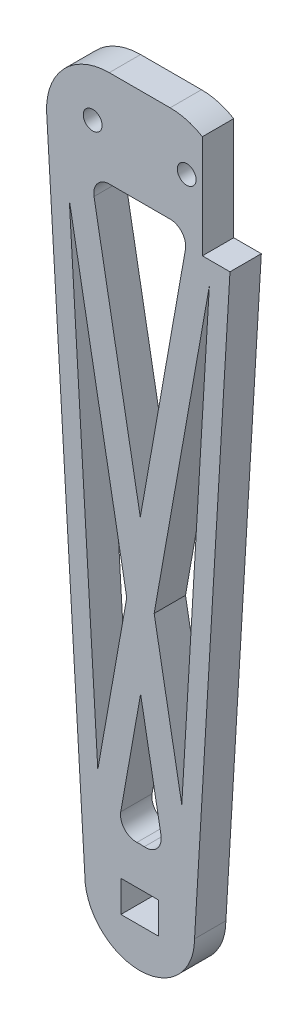
ISO-10303-21;
HEADER;
FILE_DESCRIPTION(('STEP AP214'),'2;1');
FILE_NAME('part.step','',(''),(''),'','','');
FILE_SCHEMA(('AUTOMOTIVE_DESIGN { 1 0 10303 214 1 1 1 1 }'));
ENDSEC;
DATA;
#1=APPLICATION_CONTEXT('core data for automotive mechanical design processes');
#2=APPLICATION_PROTOCOL_DEFINITION('international standard','automotive_design',2000,#1);
#3=PRODUCT_CONTEXT('',#1,'mechanical');
#4=PRODUCT('Part','Part','',(#3));
#5=PRODUCT_RELATED_PRODUCT_CATEGORY('part','',(#4));
#6=PRODUCT_DEFINITION_FORMATION('','',#4);
#7=PRODUCT_DEFINITION_CONTEXT('part definition',#1,'design');
#8=PRODUCT_DEFINITION('design','',#6,#7);
#9=PRODUCT_DEFINITION_SHAPE('','',#8);
#10=(LENGTH_UNIT() NAMED_UNIT(*) SI_UNIT(.MILLI.,.METRE.));
#11=(NAMED_UNIT(*) PLANE_ANGLE_UNIT() SI_UNIT($,.RADIAN.));
#12=(NAMED_UNIT(*) SI_UNIT($,.STERADIAN.) SOLID_ANGLE_UNIT());
#13=UNCERTAINTY_MEASURE_WITH_UNIT(LENGTH_MEASURE(1.E-05),#10,'distance_accuracy_value','');
#14=(GEOMETRIC_REPRESENTATION_CONTEXT(3) GLOBAL_UNCERTAINTY_ASSIGNED_CONTEXT((#13)) GLOBAL_UNIT_ASSIGNED_CONTEXT((#10,
#11,#12)) REPRESENTATION_CONTEXT('',''));
#15=CARTESIAN_POINT('',(0.,0.,0.));
#16=DIRECTION('',(0.,0.,1.));
#17=DIRECTION('',(1.,0.,0.));
#18=AXIS2_PLACEMENT_3D('',#15,#16,#17);
#19=CARTESIAN_POINT('',(0.,0.,10.));
#20=DIRECTION('',(0.,0.,1.));
#21=DIRECTION('',(1.,0.,0.));
#22=AXIS2_PLACEMENT_3D('',#19,#20,#21);
#23=PLANE('',#22);
#24=CARTESIAN_POINT('',(15.,0.,10.));
#25=DIRECTION('',(0.,0.,1.));
#26=DIRECTION('',(1.,0.,0.));
#27=AXIS2_PLACEMENT_3D('',#24,#25,#26);
#28=CIRCLE('',#27,3.);
#29=CARTESIAN_POINT('',(18.,0.,10.));
#30=VERTEX_POINT('',#29);
#31=EDGE_CURVE('E417',#30,#30,#28,.T.);
#32=ORIENTED_EDGE('',*,*,#31,.F.);
#33=EDGE_LOOP('',(#32));
#34=FACE_BOUND('',#33,.T.);
#35=CARTESIAN_POINT('',(-15.,0.,10.));
#36=DIRECTION('',(0.,0.,1.));
#37=DIRECTION('',(1.,0.,0.));
#38=AXIS2_PLACEMENT_3D('',#35,#36,#37);
#39=CIRCLE('',#38,3.);
#40=CARTESIAN_POINT('',(-12.,0.,10.));
#41=VERTEX_POINT('',#40);
#42=EDGE_CURVE('E420',#41,#41,#39,.T.);
#43=ORIENTED_EDGE('',*,*,#42,.F.);
#44=EDGE_LOOP('',(#43));
#45=FACE_BOUND('',#44,.T.);
#46=DIRECTION('',(0.,1.,0.));
#47=VECTOR('',#46,1.);
#48=CARTESIAN_POINT('',(-6.00000000000001,0.,10.));
#49=LINE('',#48,#47);
#50=CARTESIAN_POINT('',(-6.00000000000001,-215.,10.));
#51=VERTEX_POINT('',#50);
#52=CARTESIAN_POINT('',(-6.00000000000001,-205.,10.));
#53=VERTEX_POINT('',#52);
#54=EDGE_CURVE('E423',#51,#53,#49,.T.);
#55=ORIENTED_EDGE('',*,*,#54,.T.);
#56=DIRECTION('',(1.,0.,0.));
#57=VECTOR('',#56,1.);
#58=CARTESIAN_POINT('',(4.74157750100327E-13,-205.,10.));
#59=LINE('',#58,#57);
#60=CARTESIAN_POINT('',(6.,-205.,10.));
#61=VERTEX_POINT('',#60);
#62=EDGE_CURVE('E426',#53,#61,#59,.T.);
#63=ORIENTED_EDGE('',*,*,#62,.T.);
#64=DIRECTION('',(0.,1.,0.));
#65=VECTOR('',#64,1.);
#66=CARTESIAN_POINT('',(5.99999999999989,0.,10.));
#67=LINE('',#66,#65);
#68=CARTESIAN_POINT('',(6.00000000000001,-215.,10.));
#69=VERTEX_POINT('',#68);
#70=EDGE_CURVE('E428',#69,#61,#67,.T.);
#71=ORIENTED_EDGE('',*,*,#70,.F.);
#72=DIRECTION('',(1.,0.,0.));
#73=VECTOR('',#72,1.);
#74=CARTESIAN_POINT('',(-4.97287396446684E-13,-215.,10.));
#75=LINE('',#74,#73);
#76=EDGE_CURVE('E431',#51,#69,#75,.T.);
#77=ORIENTED_EDGE('',*,*,#76,.F.);
#78=EDGE_LOOP('',(#55,#63,#71,#77));
#79=FACE_BOUND('',#78,.T.);
#80=DIRECTION('',(0.174574666070561,0.984643938673444,0.));
#81=VECTOR('',#80,1.);
#82=CARTESIAN_POINT('',(17.7452712206691,-3.14618785126878,10.));
#83=LINE('',#82,#81);
#84=CARTESIAN_POINT('',(0.190220551076297,-102.160979768059,10.));
#85=VERTEX_POINT('',#84);
#86=CARTESIAN_POINT('',(14.6023785703389,-20.8728733303528,10.));
#87=VERTEX_POINT('',#86);
#88=EDGE_CURVE('E399',#85,#87,#83,.T.);
#89=ORIENTED_EDGE('',*,*,#88,.F.);
#90=DIRECTION('',(-0.178826073356073,0.983880701857724,0.));
#91=VECTOR('',#90,1.);
#92=CARTESIAN_POINT('',(-17.7904251161172,-3.23351384049256,10.));
#93=LINE('',#92,#91);
#94=CARTESIAN_POINT('',(-14.5805047462184,-20.8941303667804,10.));
#95=VERTEX_POINT('',#94);
#96=EDGE_CURVE('E360',#85,#95,#93,.T.);
#97=ORIENTED_EDGE('',*,*,#96,.T.);
#98=CARTESIAN_POINT('',(-9.66110123692979,-20.,10.));
#99=DIRECTION('',(0.,0.,1.));
#100=DIRECTION('',(1.,0.,0.));
#101=AXIS2_PLACEMENT_3D('',#98,#99,#100);
#102=CIRCLE('',#101,5.);
#103=CARTESIAN_POINT('',(-9.66110123692979,-15.,10.));
#104=VERTEX_POINT('',#103);
#105=EDGE_CURVE('E516',#95,#104,#102,.F.);
#106=ORIENTED_EDGE('',*,*,#105,.T.);
#107=DIRECTION('',(1.,0.,0.));
#108=VECTOR('',#107,1.);
#109=CARTESIAN_POINT('',(0.,-15.,10.));
#110=LINE('',#109,#108);
#111=CARTESIAN_POINT('',(9.67915887697167,-15.,10.));
#112=VERTEX_POINT('',#111);
#113=EDGE_CURVE('E391',#104,#112,#110,.T.);
#114=ORIENTED_EDGE('',*,*,#113,.T.);
#115=CARTESIAN_POINT('',(9.67915887697167,-20.,10.));
#116=DIRECTION('',(0.,0.,1.));
#117=DIRECTION('',(1.,0.,0.));
#118=AXIS2_PLACEMENT_3D('',#115,#116,#117);
#119=CIRCLE('',#118,5.);
#120=EDGE_CURVE('E115',#112,#87,#119,.F.);
#121=ORIENTED_EDGE('',*,*,#120,.T.);
#122=EDGE_LOOP('',(#89,#97,#106,#114,#121));
#123=FACE_BOUND('',#122,.T.);
#124=DIRECTION('',(-0.178826073356073,0.983880701857724,0.));
#125=VECTOR('',#124,1.);
#126=CARTESIAN_POINT('',(-26.2678721622271,-4.77433943497515,10.));
#127=LINE('',#126,#125);
#128=CARTESIAN_POINT('',(6.79531038371948,-186.684206595022,10.));
#129=VERTEX_POINT('',#128);
#130=CARTESIAN_POINT('',(0.29160959832128,-150.901585116392,10.));
#131=VERTEX_POINT('',#130);
#132=EDGE_CURVE('E332',#129,#131,#127,.T.);
#133=ORIENTED_EDGE('',*,*,#132,.F.);
#134=CARTESIAN_POINT('',(1.87590687443086,-187.578336961803,10.));
#135=DIRECTION('',(0.,0.,1.));
#136=DIRECTION('',(1.,0.,0.));
#137=AXIS2_PLACEMENT_3D('',#134,#135,#136);
#138=CIRCLE('',#137,5.);
#139=CARTESIAN_POINT('',(1.45903868011289,-192.560928748069,10.));
#140=VERTEX_POINT('',#139);
#141=EDGE_CURVE('E508',#129,#140,#138,.F.);
#142=ORIENTED_EDGE('',*,*,#141,.T.);
#143=CARTESIAN_POINT('',(0.,-210.,10.));
#144=DIRECTION('',(0.,0.,1.));
#145=DIRECTION('',(1.,0.,0.));
#146=AXIS2_PLACEMENT_3D('',#143,#144,#145);
#147=CIRCLE('',#146,17.5);
#148=CARTESIAN_POINT('',(-0.874372767581587,-192.521857299378,10.));
#149=VERTEX_POINT('',#148);
#150=EDGE_CURVE('E317',#140,#149,#147,.T.);
#151=ORIENTED_EDGE('',*,*,#150,.T.);
#152=CARTESIAN_POINT('',(-1.12419355831918,-187.528102242057,10.));
#153=DIRECTION('',(0.,0.,1.));
#154=DIRECTION('',(1.,0.,0.));
#155=AXIS2_PLACEMENT_3D('',#152,#153,#154);
#156=CIRCLE('',#155,5.);
#157=CARTESIAN_POINT('',(-6.0474132516864,-186.655228911704,10.));
#158=VERTEX_POINT('',#157);
#159=EDGE_CURVE('E512',#149,#158,#156,.F.);
#160=ORIENTED_EDGE('',*,*,#159,.T.);
#161=DIRECTION('',(0.174574666070561,0.984643938673444,0.));
#162=VECTOR('',#161,1.);
#163=CARTESIAN_POINT('',(26.2217824014059,-4.64905000346376,10.));
#164=LINE('',#163,#162);
#165=EDGE_CURVE('E324',#158,#131,#164,.T.);
#166=ORIENTED_EDGE('',*,*,#165,.T.);
#167=EDGE_LOOP('',(#133,#142,#151,#160,#166));
#168=FACE_BOUND('',#167,.T.);
#169=DIRECTION('',(-0.178826073356073,0.983880701857724,0.));
#170=VECTOR('',#169,1.);
#171=CARTESIAN_POINT('',(-17.7904251161172,-3.23351384049256,10.));
#172=LINE('',#171,#170);
#173=CARTESIAN_POINT('',(13.4301626709257,-175.005634358752,10.));
#174=VERTEX_POINT('',#173);
#175=CARTESIAN_POINT('',(4.61598635326493,-126.511039476885,10.));
#176=VERTEX_POINT('',#175);
#177=EDGE_CURVE('E376',#174,#176,#172,.T.);
#178=ORIENTED_EDGE('',*,*,#177,.T.);
#179=DIRECTION('',(0.174574666070561,0.984643938673444,0.));
#180=VECTOR('',#179,1.);
#181=CARTESIAN_POINT('',(26.2217824014059,-4.64905000346376,10.));
#182=LINE('',#181,#180);
#183=CARTESIAN_POINT('',(22.2304198411749,-27.1613138985647,10.));
#184=VERTEX_POINT('',#183);
#185=EDGE_CURVE('E338',#176,#184,#182,.T.);
#186=ORIENTED_EDGE('',*,*,#185,.T.);
#187=DIRECTION('',(-0.0594186399842153,-0.998233151734817,0.));
#188=VECTOR('',#187,1.);
#189=CARTESIAN_POINT('',(23.7629705178262,-1.41446253082299,10.));
#190=LINE('',#189,#188);
#191=EDGE_CURVE('E368',#184,#174,#190,.T.);
#192=ORIENTED_EDGE('',*,*,#191,.T.);
#193=EDGE_LOOP('',(#178,#186,#192));
#194=FACE_BOUND('',#193,.T.);
#195=DIRECTION('',(0.174574666070561,0.984643938673444,0.));
#196=VECTOR('',#195,1.);
#197=CARTESIAN_POINT('',(17.7452712206691,-3.14618785126878,10.));
#198=LINE('',#197,#196);
#199=CARTESIAN_POINT('',(-13.367328464566,-178.628881795291,10.));
#200=VERTEX_POINT('',#199);
#201=CARTESIAN_POINT('',(-4.13415620386734,-126.551525407566,10.));
#202=VERTEX_POINT('',#201);
#203=EDGE_CURVE('E352',#200,#202,#198,.T.);
#204=ORIENTED_EDGE('',*,*,#203,.F.);
#205=DIRECTION('',(-0.0594186399842153,0.998233151734817,0.));
#206=VECTOR('',#205,1.);
#207=CARTESIAN_POINT('',(-23.9152662053382,-1.42352775031775,10.));
#208=LINE('',#207,#206);
#209=CARTESIAN_POINT('',(-22.4730270714025,-25.6531452004381,10.));
#210=VERTEX_POINT('',#209);
#211=EDGE_CURVE('E349',#200,#210,#208,.T.);
#212=ORIENTED_EDGE('',*,*,#211,.T.);
#213=DIRECTION('',(-0.178826073356073,0.983880701857724,0.));
#214=VECTOR('',#213,1.);
#215=CARTESIAN_POINT('',(-26.2678721622271,-4.77433943497515,10.));
#216=LINE('',#215,#214);
#217=EDGE_CURVE('E342',#202,#210,#216,.T.);
#218=ORIENTED_EDGE('',*,*,#217,.F.);
#219=EDGE_LOOP('',(#204,#212,#218));
#220=FACE_BOUND('',#219,.T.);
#221=DIRECTION('',(-0.0594186399842153,-0.998233151734817,0.));
#222=VECTOR('',#221,1.);
#223=CARTESIAN_POINT('',(29.8940827566728,-1.77940968789719,10.));
#224=LINE('',#223,#222);
#225=CARTESIAN_POINT('',(28.8095238095238,-20.,10.));
#226=VERTEX_POINT('',#225);
#227=CARTESIAN_POINT('',(17.5,-210.,10.));
#228=VERTEX_POINT('',#227);
#229=EDGE_CURVE('E412',#226,#228,#224,.T.);
#230=ORIENTED_EDGE('',*,*,#229,.F.);
#231=DIRECTION('',(-1.,0.,0.));
#232=VECTOR('',#231,1.);
#233=CARTESIAN_POINT('',(0.,-20.,10.));
#234=LINE('',#233,#232);
#235=CARTESIAN_POINT('',(20.,-20.,10.));
#236=VERTEX_POINT('',#235);
#237=EDGE_CURVE('E312',#226,#236,#234,.T.);
#238=ORIENTED_EDGE('',*,*,#237,.T.);
#239=DIRECTION('',(0.,-1.,0.));
#240=VECTOR('',#239,1.);
#241=CARTESIAN_POINT('',(20.,0.,10.));
#242=LINE('',#241,#240);
#243=CARTESIAN_POINT('',(20.,12.9219237424976,10.));
#244=VERTEX_POINT('',#243);
#245=EDGE_CURVE('E305',#244,#236,#242,.T.);
#246=ORIENTED_EDGE('',*,*,#245,.F.);
#247=CARTESIAN_POINT('',(9.71283934950197,-4.22958714578407,10.));
#248=DIRECTION('',(0.,0.,1.));
#249=DIRECTION('',(1.,0.,0.));
#250=AXIS2_PLACEMENT_3D('',#247,#248,#249);
#251=CIRCLE('',#250,20.);
#252=CARTESIAN_POINT('',(9.71283934950197,15.7704128542159,10.));
#253=VERTEX_POINT('',#252);
#254=EDGE_CURVE('E487',#244,#253,#251,.T.);
#255=ORIENTED_EDGE('',*,*,#254,.T.);
#256=DIRECTION('',(1.,0.,0.));
#257=VECTOR('',#256,1.);
#258=CARTESIAN_POINT('',(0.,15.7704128542159,10.));
#259=LINE('',#258,#257);
#260=CARTESIAN_POINT('',(-9.71283934950197,15.7704128542159,10.));
#261=VERTEX_POINT('',#260);
#262=EDGE_CURVE('E414',#261,#253,#259,.T.);
#263=ORIENTED_EDGE('',*,*,#262,.F.);
#264=CARTESIAN_POINT('',(-9.71283934950197,-4.22958714578407,10.));
#265=DIRECTION('',(0.,0.,1.));
#266=DIRECTION('',(1.,0.,0.));
#267=AXIS2_PLACEMENT_3D('',#264,#265,#266);
#268=CIRCLE('',#267,20.);
#269=CARTESIAN_POINT('',(-29.6775023841983,-5.41795994546837,10.));
#270=VERTEX_POINT('',#269);
#271=EDGE_CURVE('E481',#261,#270,#268,.T.);
#272=ORIENTED_EDGE('',*,*,#271,.T.);
#273=DIRECTION('',(0.0594186399842153,-0.998233151734817,0.));
#274=VECTOR('',#273,1.);
#275=CARTESIAN_POINT('',(-29.8940827566728,-1.77940968789719,10.));
#276=LINE('',#275,#274);
#277=CARTESIAN_POINT('',(-17.5,-210.,10.));
#278=VERTEX_POINT('',#277);
#279=EDGE_CURVE('E406',#270,#278,#276,.T.);
#280=ORIENTED_EDGE('',*,*,#279,.T.);
#281=CARTESIAN_POINT('',(0.,-210.,10.));
#282=DIRECTION('',(0.,0.,1.));
#283=DIRECTION('',(1.,0.,0.));
#284=AXIS2_PLACEMENT_3D('',#281,#282,#283);
#285=CIRCLE('',#284,17.5);
#286=EDGE_CURVE('E408',#278,#228,#285,.T.);
#287=ORIENTED_EDGE('',*,*,#286,.T.);
#288=EDGE_LOOP('',(#230,#238,#246,#255,#263,#272,#280,#287));
#289=FACE_BOUND('',#288,.T.);
#290=ADVANCED_FACE('F107',(#34,#45,#79,#123,#168,#194,#220,#289),#23,.T.);
#291=CARTESIAN_POINT('',(0.,0.,0.));
#292=DIRECTION('',(0.,0.,1.));
#293=DIRECTION('',(1.,0.,0.));
#294=AXIS2_PLACEMENT_3D('',#291,#292,#293);
#295=PLANE('',#294);
#296=DIRECTION('',(-0.0594186399842153,0.998233151734817,0.));
#297=VECTOR('',#296,1.);
#298=CARTESIAN_POINT('',(-23.9152662053382,-1.42352775031775,0.));
#299=LINE('',#298,#297);
#300=CARTESIAN_POINT('',(-13.367328464566,-178.628881795291,0.));
#301=VERTEX_POINT('',#300);
#302=CARTESIAN_POINT('',(-22.4730270714025,-25.6531452004381,0.));
#303=VERTEX_POINT('',#302);
#304=EDGE_CURVE('E339',#301,#303,#299,.T.);
#305=ORIENTED_EDGE('',*,*,#304,.F.);
#306=DIRECTION('',(0.174574666070561,0.984643938673444,0.));
#307=VECTOR('',#306,1.);
#308=CARTESIAN_POINT('',(17.7452712206691,-3.14618785126878,0.));
#309=LINE('',#308,#307);
#310=CARTESIAN_POINT('',(-4.13415620386734,-126.551525407566,0.));
#311=VERTEX_POINT('',#310);
#312=EDGE_CURVE('E341',#301,#311,#309,.T.);
#313=ORIENTED_EDGE('',*,*,#312,.T.);
#314=DIRECTION('',(-0.178826073356073,0.983880701857724,0.));
#315=VECTOR('',#314,1.);
#316=CARTESIAN_POINT('',(-26.2678721622271,-4.77433943497515,0.));
#317=LINE('',#316,#315);
#318=EDGE_CURVE('E345',#311,#303,#317,.T.);
#319=ORIENTED_EDGE('',*,*,#318,.T.);
#320=EDGE_LOOP('',(#305,#313,#319));
#321=FACE_BOUND('',#320,.T.);
#322=CARTESIAN_POINT('',(0.,-210.,0.));
#323=DIRECTION('',(0.,0.,1.));
#324=DIRECTION('',(1.,0.,0.));
#325=AXIS2_PLACEMENT_3D('',#322,#323,#324);
#326=CIRCLE('',#325,17.5);
#327=CARTESIAN_POINT('',(1.45903868011289,-192.560928748069,0.));
#328=VERTEX_POINT('',#327);
#329=CARTESIAN_POINT('',(-0.874372767581587,-192.521857299378,0.));
#330=VERTEX_POINT('',#329);
#331=EDGE_CURVE('E320',#328,#330,#326,.T.);
#332=ORIENTED_EDGE('',*,*,#331,.F.);
#333=CARTESIAN_POINT('',(1.87590687443086,-187.578336961803,0.));
#334=DIRECTION('',(0.,0.,1.));
#335=DIRECTION('',(1.,0.,0.));
#336=AXIS2_PLACEMENT_3D('',#333,#334,#335);
#337=CIRCLE('',#336,5.);
#338=CARTESIAN_POINT('',(6.79531038371948,-186.684206595022,0.));
#339=VERTEX_POINT('',#338);
#340=EDGE_CURVE('E510',#328,#339,#337,.T.);
#341=ORIENTED_EDGE('',*,*,#340,.T.);
#342=DIRECTION('',(-0.178826073356073,0.983880701857724,0.));
#343=VECTOR('',#342,1.);
#344=CARTESIAN_POINT('',(-26.2678721622271,-4.77433943497515,0.));
#345=LINE('',#344,#343);
#346=CARTESIAN_POINT('',(0.291609598321283,-150.901585116392,0.));
#347=VERTEX_POINT('',#346);
#348=EDGE_CURVE('E323',#339,#347,#345,.T.);
#349=ORIENTED_EDGE('',*,*,#348,.T.);
#350=DIRECTION('',(0.174574666070561,0.984643938673444,0.));
#351=VECTOR('',#350,1.);
#352=CARTESIAN_POINT('',(26.2217824014059,-4.64905000346376,0.));
#353=LINE('',#352,#351);
#354=CARTESIAN_POINT('',(-6.0474132516864,-186.655228911704,0.));
#355=VERTEX_POINT('',#354);
#356=EDGE_CURVE('E327',#355,#347,#353,.T.);
#357=ORIENTED_EDGE('',*,*,#356,.F.);
#358=CARTESIAN_POINT('',(-1.12419355831918,-187.528102242057,0.));
#359=DIRECTION('',(0.,0.,1.));
#360=DIRECTION('',(1.,0.,0.));
#361=AXIS2_PLACEMENT_3D('',#358,#359,#360);
#362=CIRCLE('',#361,5.);
#363=EDGE_CURVE('E514',#355,#330,#362,.T.);
#364=ORIENTED_EDGE('',*,*,#363,.T.);
#365=EDGE_LOOP('',(#332,#341,#349,#357,#364));
#366=FACE_BOUND('',#365,.T.);
#367=DIRECTION('',(0.,1.,0.));
#368=VECTOR('',#367,1.);
#369=CARTESIAN_POINT('',(-6.00000000000001,0.,0.));
#370=LINE('',#369,#368);
#371=CARTESIAN_POINT('',(-6.00000000000001,-215.,0.));
#372=VERTEX_POINT('',#371);
#373=CARTESIAN_POINT('',(-6.00000000000001,-205.,0.));
#374=VERTEX_POINT('',#373);
#375=EDGE_CURVE('E449',#372,#374,#370,.T.);
#376=ORIENTED_EDGE('',*,*,#375,.F.);
#377=DIRECTION('',(1.,0.,0.));
#378=VECTOR('',#377,1.);
#379=CARTESIAN_POINT('',(-4.97287396446684E-13,-215.,0.));
#380=LINE('',#379,#378);
#381=CARTESIAN_POINT('',(6.00000000000001,-215.,0.));
#382=VERTEX_POINT('',#381);
#383=EDGE_CURVE('E409',#372,#382,#380,.T.);
#384=ORIENTED_EDGE('',*,*,#383,.T.);
#385=DIRECTION('',(0.,1.,0.));
#386=VECTOR('',#385,1.);
#387=CARTESIAN_POINT('',(5.99999999999989,0.,0.));
#388=LINE('',#387,#386);
#389=CARTESIAN_POINT('',(6.,-205.,0.));
#390=VERTEX_POINT('',#389);
#391=EDGE_CURVE('E455',#382,#390,#388,.T.);
#392=ORIENTED_EDGE('',*,*,#391,.T.);
#393=DIRECTION('',(1.,0.,0.));
#394=VECTOR('',#393,1.);
#395=CARTESIAN_POINT('',(4.74157750100327E-13,-205.,0.));
#396=LINE('',#395,#394);
#397=EDGE_CURVE('E452',#374,#390,#396,.T.);
#398=ORIENTED_EDGE('',*,*,#397,.F.);
#399=EDGE_LOOP('',(#376,#384,#392,#398));
#400=FACE_BOUND('',#399,.T.);
#401=CARTESIAN_POINT('',(-15.,0.,0.));
#402=DIRECTION('',(0.,0.,1.));
#403=DIRECTION('',(1.,0.,0.));
#404=AXIS2_PLACEMENT_3D('',#401,#402,#403);
#405=CIRCLE('',#404,3.);
#406=CARTESIAN_POINT('',(-12.,0.,0.));
#407=VERTEX_POINT('',#406);
#408=EDGE_CURVE('E446',#407,#407,#405,.T.);
#409=ORIENTED_EDGE('',*,*,#408,.T.);
#410=EDGE_LOOP('',(#409));
#411=FACE_BOUND('',#410,.T.);
#412=CARTESIAN_POINT('',(15.,0.,0.));
#413=DIRECTION('',(0.,0.,1.));
#414=DIRECTION('',(1.,0.,0.));
#415=AXIS2_PLACEMENT_3D('',#412,#413,#414);
#416=CIRCLE('',#415,3.);
#417=CARTESIAN_POINT('',(18.,0.,0.));
#418=VERTEX_POINT('',#417);
#419=EDGE_CURVE('E443',#418,#418,#416,.T.);
#420=ORIENTED_EDGE('',*,*,#419,.T.);
#421=EDGE_LOOP('',(#420));
#422=FACE_BOUND('',#421,.T.);
#423=DIRECTION('',(-0.178826073356073,0.983880701857724,0.));
#424=VECTOR('',#423,1.);
#425=CARTESIAN_POINT('',(-17.7904251161172,-3.23351384049256,0.));
#426=LINE('',#425,#424);
#427=CARTESIAN_POINT('',(0.190220551076304,-102.160979768059,0.));
#428=VERTEX_POINT('',#427);
#429=CARTESIAN_POINT('',(-14.5805047462184,-20.8941303667804,0.));
#430=VERTEX_POINT('',#429);
#431=EDGE_CURVE('E387',#428,#430,#426,.T.);
#432=ORIENTED_EDGE('',*,*,#431,.F.);
#433=DIRECTION('',(0.174574666070561,0.984643938673444,0.));
#434=VECTOR('',#433,1.);
#435=CARTESIAN_POINT('',(17.7452712206691,-3.14618785126878,0.));
#436=LINE('',#435,#434);
#437=CARTESIAN_POINT('',(14.6023785703389,-20.8728733303528,0.));
#438=VERTEX_POINT('',#437);
#439=EDGE_CURVE('E390',#428,#438,#436,.T.);
#440=ORIENTED_EDGE('',*,*,#439,.T.);
#441=CARTESIAN_POINT('',(9.67915887697167,-20.,0.));
#442=DIRECTION('',(0.,0.,1.));
#443=DIRECTION('',(1.,0.,0.));
#444=AXIS2_PLACEMENT_3D('',#441,#442,#443);
#445=CIRCLE('',#444,5.);
#446=CARTESIAN_POINT('',(9.67915887697167,-15.,0.));
#447=VERTEX_POINT('',#446);
#448=EDGE_CURVE('E12',#438,#447,#445,.T.);
#449=ORIENTED_EDGE('',*,*,#448,.T.);
#450=DIRECTION('',(1.,0.,0.));
#451=VECTOR('',#450,1.);
#452=CARTESIAN_POINT('',(0.,-15.,0.));
#453=LINE('',#452,#451);
#454=CARTESIAN_POINT('',(-9.66110123692979,-15.,0.));
#455=VERTEX_POINT('',#454);
#456=EDGE_CURVE('E393',#455,#447,#453,.T.);
#457=ORIENTED_EDGE('',*,*,#456,.F.);
#458=CARTESIAN_POINT('',(-9.66110123692979,-20.,0.));
#459=DIRECTION('',(0.,0.,1.));
#460=DIRECTION('',(1.,0.,0.));
#461=AXIS2_PLACEMENT_3D('',#458,#459,#460);
#462=CIRCLE('',#461,5.);
#463=EDGE_CURVE('E518',#455,#430,#462,.T.);
#464=ORIENTED_EDGE('',*,*,#463,.T.);
#465=EDGE_LOOP('',(#432,#440,#449,#457,#464));
#466=FACE_BOUND('',#465,.T.);
#467=DIRECTION('',(0.174574666070561,0.984643938673444,0.));
#468=VECTOR('',#467,1.);
#469=CARTESIAN_POINT('',(26.2217824014059,-4.64905000346376,0.));
#470=LINE('',#469,#468);
#471=CARTESIAN_POINT('',(4.61598635326493,-126.511039476885,0.));
#472=VERTEX_POINT('',#471);
#473=CARTESIAN_POINT('',(22.2304198411749,-27.1613138985647,0.));
#474=VERTEX_POINT('',#473);
#475=EDGE_CURVE('E365',#472,#474,#470,.T.);
#476=ORIENTED_EDGE('',*,*,#475,.F.);
#477=DIRECTION('',(-0.178826073356073,0.983880701857724,0.));
#478=VECTOR('',#477,1.);
#479=CARTESIAN_POINT('',(-17.7904251161172,-3.23351384049256,0.));
#480=LINE('',#479,#478);
#481=CARTESIAN_POINT('',(13.4301626709257,-175.005634358752,0.));
#482=VERTEX_POINT('',#481);
#483=EDGE_CURVE('E367',#482,#472,#480,.T.);
#484=ORIENTED_EDGE('',*,*,#483,.F.);
#485=DIRECTION('',(-0.0594186399842153,-0.998233151734817,0.));
#486=VECTOR('',#485,1.);
#487=CARTESIAN_POINT('',(23.7629705178262,-1.41446253082299,0.));
#488=LINE('',#487,#486);
#489=EDGE_CURVE('E370',#474,#482,#488,.T.);
#490=ORIENTED_EDGE('',*,*,#489,.F.);
#491=EDGE_LOOP('',(#476,#484,#490));
#492=FACE_BOUND('',#491,.T.);
#493=DIRECTION('',(-1.,0.,0.));
#494=VECTOR('',#493,1.);
#495=CARTESIAN_POINT('',(0.,-20.,0.));
#496=LINE('',#495,#494);
#497=CARTESIAN_POINT('',(28.8095238095238,-20.,0.));
#498=VERTEX_POINT('',#497);
#499=CARTESIAN_POINT('',(20.,-20.,0.));
#500=VERTEX_POINT('',#499);
#501=EDGE_CURVE('E293',#498,#500,#496,.T.);
#502=ORIENTED_EDGE('',*,*,#501,.F.);
#503=DIRECTION('',(-0.0594186399842153,-0.998233151734817,0.));
#504=VECTOR('',#503,1.);
#505=CARTESIAN_POINT('',(29.8940827566728,-1.77940968789719,0.));
#506=LINE('',#505,#504);
#507=CARTESIAN_POINT('',(17.5,-210.,0.));
#508=VERTEX_POINT('',#507);
#509=EDGE_CURVE('E439',#498,#508,#506,.T.);
#510=ORIENTED_EDGE('',*,*,#509,.T.);
#511=CARTESIAN_POINT('',(0.,-210.,0.));
#512=DIRECTION('',(0.,0.,1.));
#513=DIRECTION('',(1.,0.,0.));
#514=AXIS2_PLACEMENT_3D('',#511,#512,#513);
#515=CIRCLE('',#514,17.5);
#516=CARTESIAN_POINT('',(-17.5,-210.,0.));
#517=VERTEX_POINT('',#516);
#518=EDGE_CURVE('E436',#517,#508,#515,.T.);
#519=ORIENTED_EDGE('',*,*,#518,.F.);
#520=DIRECTION('',(0.0594186399842153,-0.998233151734817,0.));
#521=VECTOR('',#520,1.);
#522=CARTESIAN_POINT('',(-29.8940827566728,-1.77940968789719,0.));
#523=LINE('',#522,#521);
#524=CARTESIAN_POINT('',(-29.6775023841983,-5.41795994546837,0.));
#525=VERTEX_POINT('',#524);
#526=EDGE_CURVE('E405',#525,#517,#523,.T.);
#527=ORIENTED_EDGE('',*,*,#526,.F.);
#528=CARTESIAN_POINT('',(-9.71283934950197,-4.22958714578407,0.));
#529=DIRECTION('',(0.,0.,1.));
#530=DIRECTION('',(1.,0.,0.));
#531=AXIS2_PLACEMENT_3D('',#528,#529,#530);
#532=CIRCLE('',#531,20.);
#533=CARTESIAN_POINT('',(-9.71283934950197,15.7704128542159,0.));
#534=VERTEX_POINT('',#533);
#535=EDGE_CURVE('E477',#525,#534,#532,.F.);
#536=ORIENTED_EDGE('',*,*,#535,.T.);
#537=DIRECTION('',(1.,0.,0.));
#538=VECTOR('',#537,1.);
#539=CARTESIAN_POINT('',(0.,15.7704128542159,0.));
#540=LINE('',#539,#538);
#541=CARTESIAN_POINT('',(9.71283934950197,15.7704128542159,0.));
#542=VERTEX_POINT('',#541);
#543=EDGE_CURVE('E441',#534,#542,#540,.T.);
#544=ORIENTED_EDGE('',*,*,#543,.T.);
#545=CARTESIAN_POINT('',(9.71283934950197,-4.22958714578407,0.));
#546=DIRECTION('',(0.,0.,1.));
#547=DIRECTION('',(1.,0.,0.));
#548=AXIS2_PLACEMENT_3D('',#545,#546,#547);
#549=CIRCLE('',#548,20.);
#550=CARTESIAN_POINT('',(20.,12.9219237424976,0.));
#551=VERTEX_POINT('',#550);
#552=EDGE_CURVE('E311',#542,#551,#549,.F.);
#553=ORIENTED_EDGE('',*,*,#552,.T.);
#554=DIRECTION('',(0.,-1.,0.));
#555=VECTOR('',#554,1.);
#556=CARTESIAN_POINT('',(20.,0.,0.));
#557=LINE('',#556,#555);
#558=EDGE_CURVE('E122',#551,#500,#557,.T.);
#559=ORIENTED_EDGE('',*,*,#558,.T.);
#560=EDGE_LOOP('',(#502,#510,#519,#527,#536,#544,#553,#559));
#561=FACE_BOUND('',#560,.T.);
#562=ADVANCED_FACE('F309',(#321,#366,#400,#411,#422,#466,#492,#561),#295,.F.);
#563=CARTESIAN_POINT('',(29.8940827566728,-1.77940968789719,10.));
#564=DIRECTION('',(0.998233151734817,-0.0594186399842152,0.));
#565=DIRECTION('',(0.0594186399842152,0.998233151734817,0.));
#566=AXIS2_PLACEMENT_3D('',#563,#564,#565);
#567=PLANE('',#566);
#568=ORIENTED_EDGE('',*,*,#509,.F.);
#569=DIRECTION('',(0.,0.,1.));
#570=VECTOR('',#569,1.);
#571=CARTESIAN_POINT('',(28.8095238095238,-20.,0.));
#572=LINE('',#571,#570);
#573=EDGE_CURVE('E298',#498,#226,#572,.T.);
#574=ORIENTED_EDGE('',*,*,#573,.T.);
#575=ORIENTED_EDGE('',*,*,#229,.T.);
#576=DIRECTION('',(0.,0.,-1.));
#577=VECTOR('',#576,1.);
#578=CARTESIAN_POINT('',(17.5,-210.,10.));
#579=LINE('',#578,#577);
#580=EDGE_CURVE('E434',#228,#508,#579,.T.);
#581=ORIENTED_EDGE('',*,*,#580,.T.);
#582=EDGE_LOOP('',(#568,#574,#575,#581));
#583=FACE_BOUND('',#582,.T.);
#584=ADVANCED_FACE('F560',(#583),#567,.T.);
#585=CARTESIAN_POINT('',(-6.00000000000001,0.,10.));
#586=DIRECTION('',(-1.,0.,0.));
#587=DIRECTION('',(0.,0.,1.));
#588=AXIS2_PLACEMENT_3D('',#585,#586,#587);
#589=PLANE('',#588);
#590=ORIENTED_EDGE('',*,*,#375,.T.);
#591=DIRECTION('',(0.,0.,-1.));
#592=VECTOR('',#591,1.);
#593=CARTESIAN_POINT('',(-6.00000000000001,-205.,10.));
#594=LINE('',#593,#592);
#595=EDGE_CURVE('E467',#53,#374,#594,.T.);
#596=ORIENTED_EDGE('',*,*,#595,.F.);
#597=ORIENTED_EDGE('',*,*,#54,.F.);
#598=DIRECTION('',(0.,0.,-1.));
#599=VECTOR('',#598,1.);
#600=CARTESIAN_POINT('',(-6.00000000000001,-215.,10.));
#601=LINE('',#600,#599);
#602=EDGE_CURVE('E460',#51,#372,#601,.T.);
#603=ORIENTED_EDGE('',*,*,#602,.T.);
#604=EDGE_LOOP('',(#590,#596,#597,#603));
#605=FACE_BOUND('',#604,.T.);
#606=ADVANCED_FACE('F579',(#605),#589,.F.);
#607=CARTESIAN_POINT('',(4.74157750100327E-13,-205.,10.));
#608=DIRECTION('',(0.,1.,0.));
#609=DIRECTION('',(-1.,0.,0.));
#610=AXIS2_PLACEMENT_3D('',#607,#608,#609);
#611=PLANE('',#610);
#612=ORIENTED_EDGE('',*,*,#397,.T.);
#613=DIRECTION('',(0.,0.,-1.));
#614=VECTOR('',#613,1.);
#615=CARTESIAN_POINT('',(6.,-205.,10.));
#616=LINE('',#615,#614);
#617=EDGE_CURVE('E465',#61,#390,#616,.T.);
#618=ORIENTED_EDGE('',*,*,#617,.F.);
#619=ORIENTED_EDGE('',*,*,#62,.F.);
#620=ORIENTED_EDGE('',*,*,#595,.T.);
#621=EDGE_LOOP('',(#612,#618,#619,#620));
#622=FACE_BOUND('',#621,.T.);
#623=ADVANCED_FACE('F575',(#622),#611,.F.);
#624=CARTESIAN_POINT('',(5.99999999999989,0.,10.));
#625=DIRECTION('',(-1.,0.,0.));
#626=DIRECTION('',(0.,-1.,0.));
#627=AXIS2_PLACEMENT_3D('',#624,#625,#626);
#628=PLANE('',#627);
#629=ORIENTED_EDGE('',*,*,#391,.F.);
#630=DIRECTION('',(0.,0.,-1.));
#631=VECTOR('',#630,1.);
#632=CARTESIAN_POINT('',(6.00000000000001,-215.,10.));
#633=LINE('',#632,#631);
#634=EDGE_CURVE('E462',#69,#382,#633,.T.);
#635=ORIENTED_EDGE('',*,*,#634,.F.);
#636=ORIENTED_EDGE('',*,*,#70,.T.);
#637=ORIENTED_EDGE('',*,*,#617,.T.);
#638=EDGE_LOOP('',(#629,#635,#636,#637));
#639=FACE_BOUND('',#638,.T.);
#640=ADVANCED_FACE('F571',(#639),#628,.T.);
#641=CARTESIAN_POINT('',(-29.8940827566728,-1.77940968789719,10.));
#642=DIRECTION('',(0.998233151734817,0.0594186399842152,0.));
#643=DIRECTION('',(-0.0594186399842152,0.998233151734817,0.));
#644=AXIS2_PLACEMENT_3D('',#641,#642,#643);
#645=PLANE('',#644);
#646=ORIENTED_EDGE('',*,*,#279,.F.);
#647=DIRECTION('',(0.,0.,-1.));
#648=VECTOR('',#647,1.);
#649=CARTESIAN_POINT('',(-29.6775023841983,-5.41795994546837,0.));
#650=LINE('',#649,#648);
#651=EDGE_CURVE('E470',#270,#525,#650,.T.);
#652=ORIENTED_EDGE('',*,*,#651,.T.);
#653=ORIENTED_EDGE('',*,*,#526,.T.);
#654=DIRECTION('',(0.,0.,-1.));
#655=VECTOR('',#654,1.);
#656=CARTESIAN_POINT('',(-17.5,-210.,10.));
#657=LINE('',#656,#655);
#658=EDGE_CURVE('E463',#278,#517,#657,.T.);
#659=ORIENTED_EDGE('',*,*,#658,.F.);
#660=EDGE_LOOP('',(#646,#652,#653,#659));
#661=FACE_BOUND('',#660,.T.);
#662=ADVANCED_FACE('F574',(#661),#645,.F.);
#663=CARTESIAN_POINT('',(0.,-210.,10.));
#664=DIRECTION('',(0.,0.,-1.));
#665=DIRECTION('',(-1.,0.,0.));
#666=AXIS2_PLACEMENT_3D('',#663,#664,#665);
#667=CYLINDRICAL_SURFACE('',#666,17.5);
#668=ORIENTED_EDGE('',*,*,#518,.T.);
#669=ORIENTED_EDGE('',*,*,#580,.F.);
#670=ORIENTED_EDGE('',*,*,#286,.F.);
#671=ORIENTED_EDGE('',*,*,#658,.T.);
#672=EDGE_LOOP('',(#668,#669,#670,#671));
#673=FACE_BOUND('',#672,.T.);
#674=ADVANCED_FACE('F594',(#673),#667,.T.);
#675=CARTESIAN_POINT('',(0.,15.7704128542159,10.));
#676=DIRECTION('',(0.,1.,0.));
#677=DIRECTION('',(0.,0.,1.));
#678=AXIS2_PLACEMENT_3D('',#675,#676,#677);
#679=PLANE('',#678);
#680=ORIENTED_EDGE('',*,*,#262,.T.);
#681=DIRECTION('',(0.,0.,-1.));
#682=VECTOR('',#681,1.);
#683=CARTESIAN_POINT('',(9.71283934950197,15.7704128542159,10.));
#684=LINE('',#683,#682);
#685=EDGE_CURVE('E483',#253,#542,#684,.T.);
#686=ORIENTED_EDGE('',*,*,#685,.T.);
#687=ORIENTED_EDGE('',*,*,#543,.F.);
#688=DIRECTION('',(0.,0.,-1.));
#689=VECTOR('',#688,1.);
#690=CARTESIAN_POINT('',(-9.71283934950197,15.7704128542159,10.));
#691=LINE('',#690,#689);
#692=EDGE_CURVE('E479',#534,#261,#691,.F.);
#693=ORIENTED_EDGE('',*,*,#692,.T.);
#694=EDGE_LOOP('',(#680,#686,#687,#693));
#695=FACE_BOUND('',#694,.T.);
#696=ADVANCED_FACE('F587',(#695),#679,.T.);
#697=CARTESIAN_POINT('',(-15.,0.,10.));
#698=DIRECTION('',(0.,0.,-1.));
#699=DIRECTION('',(-1.,0.,0.));
#700=AXIS2_PLACEMENT_3D('',#697,#698,#699);
#701=CYLINDRICAL_SURFACE('',#700,3.);
#702=ORIENTED_EDGE('',*,*,#42,.T.);
#703=EDGE_LOOP('',(#702));
#704=FACE_BOUND('',#703,.T.);
#705=ORIENTED_EDGE('',*,*,#408,.F.);
#706=EDGE_LOOP('',(#705));
#707=FACE_BOUND('',#706,.T.);
#708=ADVANCED_FACE('F584',(#704,#707),#701,.F.);
#709=CARTESIAN_POINT('',(15.,0.,10.));
#710=DIRECTION('',(0.,0.,-1.));
#711=DIRECTION('',(-1.,0.,0.));
#712=AXIS2_PLACEMENT_3D('',#709,#710,#711);
#713=CYLINDRICAL_SURFACE('',#712,3.);
#714=ORIENTED_EDGE('',*,*,#31,.T.);
#715=EDGE_LOOP('',(#714));
#716=FACE_BOUND('',#715,.T.);
#717=ORIENTED_EDGE('',*,*,#419,.F.);
#718=EDGE_LOOP('',(#717));
#719=FACE_BOUND('',#718,.T.);
#720=ADVANCED_FACE('F569',(#716,#719),#713,.F.);
#721=CARTESIAN_POINT('',(-4.97287396446684E-13,-215.,10.));
#722=DIRECTION('',(0.,1.,0.));
#723=DIRECTION('',(-1.,0.,0.));
#724=AXIS2_PLACEMENT_3D('',#721,#722,#723);
#725=PLANE('',#724);
#726=ORIENTED_EDGE('',*,*,#383,.F.);
#727=ORIENTED_EDGE('',*,*,#602,.F.);
#728=ORIENTED_EDGE('',*,*,#76,.T.);
#729=ORIENTED_EDGE('',*,*,#634,.T.);
#730=EDGE_LOOP('',(#726,#727,#728,#729));
#731=FACE_BOUND('',#730,.T.);
#732=ADVANCED_FACE('F566',(#731),#725,.T.);
#733=CARTESIAN_POINT('',(-9.71283934950197,-4.22958714578407,10.));
#734=DIRECTION('',(0.,0.,1.));
#735=DIRECTION('',(1.,0.,0.));
#736=AXIS2_PLACEMENT_3D('',#733,#734,#735);
#737=CYLINDRICAL_SURFACE('',#736,20.);
#738=ORIENTED_EDGE('',*,*,#271,.F.);
#739=ORIENTED_EDGE('',*,*,#692,.F.);
#740=ORIENTED_EDGE('',*,*,#535,.F.);
#741=ORIENTED_EDGE('',*,*,#651,.F.);
#742=EDGE_LOOP('',(#738,#739,#740,#741));
#743=FACE_BOUND('',#742,.T.);
#744=ADVANCED_FACE('F549',(#743),#737,.T.);
#745=CARTESIAN_POINT('',(9.71283934950197,-4.22958714578407,10.));
#746=DIRECTION('',(0.,0.,-1.));
#747=DIRECTION('',(-1.,0.,0.));
#748=AXIS2_PLACEMENT_3D('',#745,#746,#747);
#749=CYLINDRICAL_SURFACE('',#748,20.);
#750=DIRECTION('',(0.,0.,1.));
#751=VECTOR('',#750,1.);
#752=CARTESIAN_POINT('',(20.,12.9219237424976,0.));
#753=LINE('',#752,#751);
#754=EDGE_CURVE('E301',#551,#244,#753,.T.);
#755=ORIENTED_EDGE('',*,*,#754,.F.);
#756=ORIENTED_EDGE('',*,*,#552,.F.);
#757=ORIENTED_EDGE('',*,*,#685,.F.);
#758=ORIENTED_EDGE('',*,*,#254,.F.);
#759=EDGE_LOOP('',(#755,#756,#757,#758));
#760=FACE_BOUND('',#759,.T.);
#761=ADVANCED_FACE('F541',(#760),#749,.T.);
#762=CARTESIAN_POINT('',(-17.7904251161172,-3.23351384049256,0.));
#763=DIRECTION('',(0.983880701857725,0.178826073356073,0.));
#764=DIRECTION('',(-0.178826073356073,0.983880701857725,0.));
#765=AXIS2_PLACEMENT_3D('',#762,#763,#764);
#766=PLANE('',#765);
#767=ORIENTED_EDGE('',*,*,#431,.T.);
#768=DIRECTION('',(0.,0.,1.));
#769=VECTOR('',#768,1.);
#770=CARTESIAN_POINT('',(-14.5805047462184,-20.8941303667804,10.));
#771=LINE('',#770,#769);
#772=EDGE_CURVE('E499',#430,#95,#771,.T.);
#773=ORIENTED_EDGE('',*,*,#772,.T.);
#774=ORIENTED_EDGE('',*,*,#96,.F.);
#775=DIRECTION('',(0.,0.,1.));
#776=VECTOR('',#775,1.);
#777=CARTESIAN_POINT('',(0.190220551076304,-102.160979768059,0.));
#778=LINE('',#777,#776);
#779=EDGE_CURVE('E396',#428,#85,#778,.T.);
#780=ORIENTED_EDGE('',*,*,#779,.F.);
#781=EDGE_LOOP('',(#767,#773,#774,#780));
#782=FACE_BOUND('',#781,.T.);
#783=ADVANCED_FACE('F539',(#782),#766,.T.);
#784=CARTESIAN_POINT('',(0.,-15.,0.));
#785=DIRECTION('',(0.,-1.,0.));
#786=DIRECTION('',(0.,0.,-1.));
#787=AXIS2_PLACEMENT_3D('',#784,#785,#786);
#788=PLANE('',#787);
#789=ORIENTED_EDGE('',*,*,#113,.F.);
#790=DIRECTION('',(0.,0.,1.));
#791=VECTOR('',#790,1.);
#792=CARTESIAN_POINT('',(-9.66110123692979,-15.,0.));
#793=LINE('',#792,#791);
#794=EDGE_CURVE('E505',#104,#455,#793,.F.);
#795=ORIENTED_EDGE('',*,*,#794,.T.);
#796=ORIENTED_EDGE('',*,*,#456,.T.);
#797=DIRECTION('',(0.,0.,1.));
#798=VECTOR('',#797,1.);
#799=CARTESIAN_POINT('',(9.67915887697167,-15.,0.));
#800=LINE('',#799,#798);
#801=EDGE_CURVE('E502',#447,#112,#800,.T.);
#802=ORIENTED_EDGE('',*,*,#801,.T.);
#803=EDGE_LOOP('',(#789,#795,#796,#802));
#804=FACE_BOUND('',#803,.T.);
#805=ADVANCED_FACE('F533',(#804),#788,.T.);
#806=CARTESIAN_POINT('',(17.7452712206691,-3.14618785126878,0.));
#807=DIRECTION('',(0.984643938673444,-0.174574666070561,0.));
#808=DIRECTION('',(0.174574666070561,0.984643938673444,0.));
#809=AXIS2_PLACEMENT_3D('',#806,#807,#808);
#810=PLANE('',#809);
#811=ORIENTED_EDGE('',*,*,#88,.T.);
#812=DIRECTION('',(0.,0.,1.));
#813=VECTOR('',#812,1.);
#814=CARTESIAN_POINT('',(14.6023785703389,-20.8728733303528,0.));
#815=LINE('',#814,#813);
#816=EDGE_CURVE('E130',#87,#438,#815,.F.);
#817=ORIENTED_EDGE('',*,*,#816,.T.);
#818=ORIENTED_EDGE('',*,*,#439,.F.);
#819=ORIENTED_EDGE('',*,*,#779,.T.);
#820=EDGE_LOOP('',(#811,#817,#818,#819));
#821=FACE_BOUND('',#820,.T.);
#822=ADVANCED_FACE('F525',(#821),#810,.F.);
#823=CARTESIAN_POINT('',(0.,-210.,0.));
#824=DIRECTION('',(0.,0.,1.));
#825=DIRECTION('',(1.,0.,0.));
#826=AXIS2_PLACEMENT_3D('',#823,#824,#825);
#827=CYLINDRICAL_SURFACE('',#826,17.5);
#828=ORIENTED_EDGE('',*,*,#150,.F.);
#829=DIRECTION('',(0.,0.,1.));
#830=VECTOR('',#829,1.);
#831=CARTESIAN_POINT('',(1.45903868011289,-192.560928748069,0.));
#832=LINE('',#831,#830);
#833=EDGE_CURVE('E495',#140,#328,#832,.F.);
#834=ORIENTED_EDGE('',*,*,#833,.T.);
#835=ORIENTED_EDGE('',*,*,#331,.T.);
#836=DIRECTION('',(0.,0.,1.));
#837=VECTOR('',#836,1.);
#838=CARTESIAN_POINT('',(-0.874372767581587,-192.521857299378,0.));
#839=LINE('',#838,#837);
#840=EDGE_CURVE('E492',#330,#149,#839,.T.);
#841=ORIENTED_EDGE('',*,*,#840,.T.);
#842=EDGE_LOOP('',(#828,#834,#835,#841));
#843=FACE_BOUND('',#842,.T.);
#844=ADVANCED_FACE('F632',(#843),#827,.T.);
#845=CARTESIAN_POINT('',(26.2217824014059,-4.64905000346376,0.));
#846=DIRECTION('',(0.984643938673444,-0.174574666070561,0.));
#847=DIRECTION('',(0.174574666070561,0.984643938673444,0.));
#848=AXIS2_PLACEMENT_3D('',#845,#846,#847);
#849=PLANE('',#848);
#850=ORIENTED_EDGE('',*,*,#165,.F.);
#851=DIRECTION('',(0.,0.,-1.));
#852=VECTOR('',#851,1.);
#853=CARTESIAN_POINT('',(-6.0474132516864,-186.655228911704,0.));
#854=LINE('',#853,#852);
#855=EDGE_CURVE('E497',#158,#355,#854,.T.);
#856=ORIENTED_EDGE('',*,*,#855,.T.);
#857=ORIENTED_EDGE('',*,*,#356,.T.);
#858=DIRECTION('',(0.,0.,1.));
#859=VECTOR('',#858,1.);
#860=CARTESIAN_POINT('',(0.29160959832128,-150.901585116392,0.));
#861=LINE('',#860,#859);
#862=EDGE_CURVE('E329',#347,#131,#861,.T.);
#863=ORIENTED_EDGE('',*,*,#862,.T.);
#864=EDGE_LOOP('',(#850,#856,#857,#863));
#865=FACE_BOUND('',#864,.T.);
#866=ADVANCED_FACE('F628',(#865),#849,.T.);
#867=CARTESIAN_POINT('',(-26.2678721622271,-4.77433943497515,0.));
#868=DIRECTION('',(0.983880701857725,0.178826073356073,0.));
#869=DIRECTION('',(-0.178826073356073,0.983880701857725,0.));
#870=AXIS2_PLACEMENT_3D('',#867,#868,#869);
#871=PLANE('',#870);
#872=ORIENTED_EDGE('',*,*,#348,.F.);
#873=DIRECTION('',(0.,0.,1.));
#874=VECTOR('',#873,1.);
#875=CARTESIAN_POINT('',(6.79531038371948,-186.684206595022,0.));
#876=LINE('',#875,#874);
#877=EDGE_CURVE('E489',#339,#129,#876,.T.);
#878=ORIENTED_EDGE('',*,*,#877,.T.);
#879=ORIENTED_EDGE('',*,*,#132,.T.);
#880=ORIENTED_EDGE('',*,*,#862,.F.);
#881=EDGE_LOOP('',(#872,#878,#879,#880));
#882=FACE_BOUND('',#881,.T.);
#883=ADVANCED_FACE('F631',(#882),#871,.F.);
#884=CARTESIAN_POINT('',(26.2217824014059,-4.64905000346376,0.));
#885=DIRECTION('',(0.984643938673444,-0.174574666070561,0.));
#886=DIRECTION('',(0.174574666070561,0.984643938673444,0.));
#887=AXIS2_PLACEMENT_3D('',#884,#885,#886);
#888=PLANE('',#887);
#889=ORIENTED_EDGE('',*,*,#185,.F.);
#890=DIRECTION('',(0.,0.,1.));
#891=VECTOR('',#890,1.);
#892=CARTESIAN_POINT('',(4.61598635326493,-126.511039476885,0.));
#893=LINE('',#892,#891);
#894=EDGE_CURVE('E373',#472,#176,#893,.T.);
#895=ORIENTED_EDGE('',*,*,#894,.F.);
#896=ORIENTED_EDGE('',*,*,#475,.T.);
#897=DIRECTION('',(0.,0.,1.));
#898=VECTOR('',#897,1.);
#899=CARTESIAN_POINT('',(22.2304198411749,-27.1613138985647,0.));
#900=LINE('',#899,#898);
#901=EDGE_CURVE('E353',#474,#184,#900,.T.);
#902=ORIENTED_EDGE('',*,*,#901,.T.);
#903=EDGE_LOOP('',(#889,#895,#896,#902));
#904=FACE_BOUND('',#903,.T.);
#905=ADVANCED_FACE('F636',(#904),#888,.T.);
#906=CARTESIAN_POINT('',(23.7629705178262,-1.41446253082299,0.));
#907=DIRECTION('',(-0.998233151734817,0.0594186399842153,0.));
#908=DIRECTION('',(-0.0594186399842153,-0.998233151734817,0.));
#909=AXIS2_PLACEMENT_3D('',#906,#907,#908);
#910=PLANE('',#909);
#911=ORIENTED_EDGE('',*,*,#191,.F.);
#912=ORIENTED_EDGE('',*,*,#901,.F.);
#913=ORIENTED_EDGE('',*,*,#489,.T.);
#914=DIRECTION('',(0.,0.,1.));
#915=VECTOR('',#914,1.);
#916=CARTESIAN_POINT('',(13.4301626709257,-175.005634358752,0.));
#917=LINE('',#916,#915);
#918=EDGE_CURVE('E383',#482,#174,#917,.T.);
#919=ORIENTED_EDGE('',*,*,#918,.T.);
#920=EDGE_LOOP('',(#911,#912,#913,#919));
#921=FACE_BOUND('',#920,.T.);
#922=ADVANCED_FACE('F653',(#921),#910,.T.);
#923=CARTESIAN_POINT('',(-17.7904251161172,-3.23351384049256,0.));
#924=DIRECTION('',(0.983880701857725,0.178826073356073,0.));
#925=DIRECTION('',(-0.178826073356073,0.983880701857725,0.));
#926=AXIS2_PLACEMENT_3D('',#923,#924,#925);
#927=PLANE('',#926);
#928=ORIENTED_EDGE('',*,*,#177,.F.);
#929=ORIENTED_EDGE('',*,*,#918,.F.);
#930=ORIENTED_EDGE('',*,*,#483,.T.);
#931=ORIENTED_EDGE('',*,*,#894,.T.);
#932=EDGE_LOOP('',(#928,#929,#930,#931));
#933=FACE_BOUND('',#932,.T.);
#934=ADVANCED_FACE('F651',(#933),#927,.T.);
#935=CARTESIAN_POINT('',(-23.9152662053382,-1.42352775031775,0.));
#936=DIRECTION('',(0.998233151734817,0.0594186399842153,0.));
#937=DIRECTION('',(-0.0594186399842153,0.998233151734817,0.));
#938=AXIS2_PLACEMENT_3D('',#935,#936,#937);
#939=PLANE('',#938);
#940=ORIENTED_EDGE('',*,*,#211,.F.);
#941=DIRECTION('',(0.,0.,1.));
#942=VECTOR('',#941,1.);
#943=CARTESIAN_POINT('',(-13.367328464566,-178.628881795291,0.));
#944=LINE('',#943,#942);
#945=EDGE_CURVE('E348',#301,#200,#944,.T.);
#946=ORIENTED_EDGE('',*,*,#945,.F.);
#947=ORIENTED_EDGE('',*,*,#304,.T.);
#948=DIRECTION('',(0.,0.,1.));
#949=VECTOR('',#948,1.);
#950=CARTESIAN_POINT('',(-22.4730270714025,-25.6531452004381,0.));
#951=LINE('',#950,#949);
#952=EDGE_CURVE('E358',#303,#210,#951,.T.);
#953=ORIENTED_EDGE('',*,*,#952,.T.);
#954=EDGE_LOOP('',(#940,#946,#947,#953));
#955=FACE_BOUND('',#954,.T.);
#956=ADVANCED_FACE('F644',(#955),#939,.T.);
#957=CARTESIAN_POINT('',(-26.2678721622271,-4.77433943497515,0.));
#958=DIRECTION('',(0.983880701857725,0.178826073356073,0.));
#959=DIRECTION('',(-0.178826073356073,0.983880701857725,0.));
#960=AXIS2_PLACEMENT_3D('',#957,#958,#959);
#961=PLANE('',#960);
#962=ORIENTED_EDGE('',*,*,#217,.T.);
#963=ORIENTED_EDGE('',*,*,#952,.F.);
#964=ORIENTED_EDGE('',*,*,#318,.F.);
#965=DIRECTION('',(0.,0.,1.));
#966=VECTOR('',#965,1.);
#967=CARTESIAN_POINT('',(-4.13415620386734,-126.551525407566,0.));
#968=LINE('',#967,#966);
#969=EDGE_CURVE('E361',#311,#202,#968,.T.);
#970=ORIENTED_EDGE('',*,*,#969,.T.);
#971=EDGE_LOOP('',(#962,#963,#964,#970));
#972=FACE_BOUND('',#971,.T.);
#973=ADVANCED_FACE('F641',(#972),#961,.F.);
#974=CARTESIAN_POINT('',(17.7452712206691,-3.14618785126878,0.));
#975=DIRECTION('',(0.984643938673444,-0.174574666070561,0.));
#976=DIRECTION('',(0.174574666070561,0.984643938673444,0.));
#977=AXIS2_PLACEMENT_3D('',#974,#975,#976);
#978=PLANE('',#977);
#979=ORIENTED_EDGE('',*,*,#203,.T.);
#980=ORIENTED_EDGE('',*,*,#969,.F.);
#981=ORIENTED_EDGE('',*,*,#312,.F.);
#982=ORIENTED_EDGE('',*,*,#945,.T.);
#983=EDGE_LOOP('',(#979,#980,#981,#982));
#984=FACE_BOUND('',#983,.T.);
#985=ADVANCED_FACE('F612',(#984),#978,.F.);
#986=CARTESIAN_POINT('',(1.87590687443086,-187.578336961803,0.));
#987=DIRECTION('',(0.,0.,1.));
#988=DIRECTION('',(1.,0.,0.));
#989=AXIS2_PLACEMENT_3D('',#986,#987,#988);
#990=CYLINDRICAL_SURFACE('',#989,5.);
#991=ORIENTED_EDGE('',*,*,#340,.F.);
#992=ORIENTED_EDGE('',*,*,#833,.F.);
#993=ORIENTED_EDGE('',*,*,#141,.F.);
#994=ORIENTED_EDGE('',*,*,#877,.F.);
#995=EDGE_LOOP('',(#991,#992,#993,#994));
#996=FACE_BOUND('',#995,.T.);
#997=ADVANCED_FACE('F608',(#996),#990,.F.);
#998=CARTESIAN_POINT('',(-1.12419355831918,-187.528102242057,0.));
#999=DIRECTION('',(0.,0.,1.));
#1000=DIRECTION('',(1.,0.,0.));
#1001=AXIS2_PLACEMENT_3D('',#998,#999,#1000);
#1002=CYLINDRICAL_SURFACE('',#1001,5.);
#1003=ORIENTED_EDGE('',*,*,#363,.F.);
#1004=ORIENTED_EDGE('',*,*,#855,.F.);
#1005=ORIENTED_EDGE('',*,*,#159,.F.);
#1006=ORIENTED_EDGE('',*,*,#840,.F.);
#1007=EDGE_LOOP('',(#1003,#1004,#1005,#1006));
#1008=FACE_BOUND('',#1007,.T.);
#1009=ADVANCED_FACE('F611',(#1008),#1002,.F.);
#1010=CARTESIAN_POINT('',(-9.66110123692979,-20.,0.));
#1011=DIRECTION('',(0.,0.,-1.));
#1012=DIRECTION('',(-1.,0.,0.));
#1013=AXIS2_PLACEMENT_3D('',#1010,#1011,#1012);
#1014=CYLINDRICAL_SURFACE('',#1013,5.);
#1015=ORIENTED_EDGE('',*,*,#463,.F.);
#1016=ORIENTED_EDGE('',*,*,#794,.F.);
#1017=ORIENTED_EDGE('',*,*,#105,.F.);
#1018=ORIENTED_EDGE('',*,*,#772,.F.);
#1019=EDGE_LOOP('',(#1015,#1016,#1017,#1018));
#1020=FACE_BOUND('',#1019,.T.);
#1021=ADVANCED_FACE('F536',(#1020),#1014,.F.);
#1022=CARTESIAN_POINT('',(9.67915887697167,-20.,0.));
#1023=DIRECTION('',(0.,0.,1.));
#1024=DIRECTION('',(1.,0.,0.));
#1025=AXIS2_PLACEMENT_3D('',#1022,#1023,#1024);
#1026=CYLINDRICAL_SURFACE('',#1025,5.);
#1027=ORIENTED_EDGE('',*,*,#448,.F.);
#1028=ORIENTED_EDGE('',*,*,#816,.F.);
#1029=ORIENTED_EDGE('',*,*,#120,.F.);
#1030=ORIENTED_EDGE('',*,*,#801,.F.);
#1031=EDGE_LOOP('',(#1027,#1028,#1029,#1030));
#1032=FACE_BOUND('',#1031,.T.);
#1033=ADVANCED_FACE('F109',(#1032),#1026,.F.);
#1034=CARTESIAN_POINT('',(0.,-20.,0.));
#1035=DIRECTION('',(0.,1.,0.));
#1036=DIRECTION('',(0.,0.,1.));
#1037=AXIS2_PLACEMENT_3D('',#1034,#1035,#1036);
#1038=PLANE('',#1037);
#1039=ORIENTED_EDGE('',*,*,#237,.F.);
#1040=ORIENTED_EDGE('',*,*,#573,.F.);
#1041=ORIENTED_EDGE('',*,*,#501,.T.);
#1042=DIRECTION('',(0.,0.,1.));
#1043=VECTOR('',#1042,1.);
#1044=CARTESIAN_POINT('',(20.,-20.,0.));
#1045=LINE('',#1044,#1043);
#1046=EDGE_CURVE('E295',#500,#236,#1045,.T.);
#1047=ORIENTED_EDGE('',*,*,#1046,.T.);
#1048=EDGE_LOOP('',(#1039,#1040,#1041,#1047));
#1049=FACE_BOUND('',#1048,.T.);
#1050=ADVANCED_FACE('F294',(#1049),#1038,.T.);
#1051=CARTESIAN_POINT('',(20.,0.,0.));
#1052=DIRECTION('',(-1.,0.,0.));
#1053=DIRECTION('',(0.,0.,1.));
#1054=AXIS2_PLACEMENT_3D('',#1051,#1052,#1053);
#1055=PLANE('',#1054);
#1056=ORIENTED_EDGE('',*,*,#245,.T.);
#1057=ORIENTED_EDGE('',*,*,#1046,.F.);
#1058=ORIENTED_EDGE('',*,*,#558,.F.);
#1059=ORIENTED_EDGE('',*,*,#754,.T.);
#1060=EDGE_LOOP('',(#1056,#1057,#1058,#1059));
#1061=FACE_BOUND('',#1060,.T.);
#1062=ADVANCED_FACE('F303',(#1061),#1055,.F.);
#1063=CLOSED_SHELL('',(#290,#562,#584,#606,#623,#640,#662,#674,#696,#708,#720,#732,#744,#761,
#783,#805,#822,#844,#866,#883,#905,#922,#934,#956,#973,#985,#997,#1009,#1021,#1033,#1050,#1062));
#1064=MANIFOLD_SOLID_BREP('B2',#1063);
#1065=ADVANCED_BREP_SHAPE_REPRESENTATION('',(#18,#1064),#14);
#1066=SHAPE_DEFINITION_REPRESENTATION(#9,#1065);
ENDSEC;
END-ISO-10303-21;
